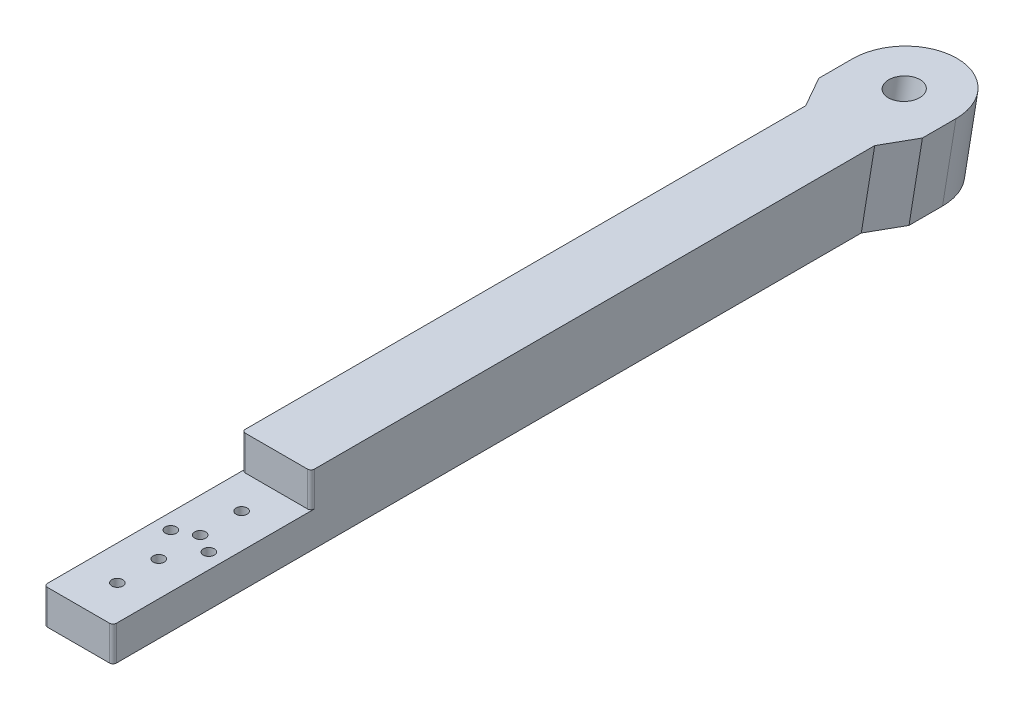
ISO-10303-21;
HEADER;
FILE_DESCRIPTION(('STEP AP214'),'2;1');
FILE_NAME('part.step','',(''),(''),'','','');
FILE_SCHEMA(('AUTOMOTIVE_DESIGN { 1 0 10303 214 1 1 1 1 }'));
ENDSEC;
DATA;
#1=APPLICATION_CONTEXT('core data for automotive mechanical design processes');
#2=APPLICATION_PROTOCOL_DEFINITION('international standard','automotive_design',2000,#1);
#3=PRODUCT_CONTEXT('',#1,'mechanical');
#4=PRODUCT('Part','Part','',(#3));
#5=PRODUCT_RELATED_PRODUCT_CATEGORY('part','',(#4));
#6=PRODUCT_DEFINITION_FORMATION('','',#4);
#7=PRODUCT_DEFINITION_CONTEXT('part definition',#1,'design');
#8=PRODUCT_DEFINITION('design','',#6,#7);
#9=PRODUCT_DEFINITION_SHAPE('','',#8);
#10=(LENGTH_UNIT() NAMED_UNIT(*) SI_UNIT(.MILLI.,.METRE.));
#11=(NAMED_UNIT(*) PLANE_ANGLE_UNIT() SI_UNIT($,.RADIAN.));
#12=(NAMED_UNIT(*) SI_UNIT($,.STERADIAN.) SOLID_ANGLE_UNIT());
#13=UNCERTAINTY_MEASURE_WITH_UNIT(LENGTH_MEASURE(1.E-05),#10,'distance_accuracy_value','');
#14=(GEOMETRIC_REPRESENTATION_CONTEXT(3) GLOBAL_UNCERTAINTY_ASSIGNED_CONTEXT((#13)) GLOBAL_UNIT_ASSIGNED_CONTEXT((#10,
#11,#12)) REPRESENTATION_CONTEXT('',''));
#15=CARTESIAN_POINT('',(0.,0.,0.));
#16=DIRECTION('',(0.,0.,1.));
#17=DIRECTION('',(1.,0.,0.));
#18=AXIS2_PLACEMENT_3D('',#15,#16,#17);
#19=CARTESIAN_POINT('',(-9.,10.,-58.35));
#20=DIRECTION('',(0.,1.,0.));
#21=DIRECTION('',(0.,0.,1.));
#22=AXIS2_PLACEMENT_3D('',#19,#20,#21);
#23=CYLINDRICAL_SURFACE('',#22,1.);
#24=CARTESIAN_POINT('',(-9.,10.,-58.35));
#25=DIRECTION('',(0.,1.,0.));
#26=DIRECTION('',(0.,0.,1.));
#27=AXIS2_PLACEMENT_3D('',#24,#25,#26);
#28=CIRCLE('',#27,1.);
#29=CARTESIAN_POINT('',(-10.,10.,-58.35));
#30=VERTEX_POINT('',#29);
#31=CARTESIAN_POINT('',(-9.,10.,-57.35));
#32=VERTEX_POINT('',#31);
#33=EDGE_CURVE('E310',#30,#32,#28,.T.);
#34=ORIENTED_EDGE('',*,*,#33,.F.);
#35=DIRECTION('',(0.,1.,0.));
#36=VECTOR('',#35,1.);
#37=CARTESIAN_POINT('',(-10.,10.,-58.35));
#38=LINE('',#37,#36);
#39=CARTESIAN_POINT('',(-10.,0.,-58.35));
#40=VERTEX_POINT('',#39);
#41=EDGE_CURVE('E213',#40,#30,#38,.T.);
#42=ORIENTED_EDGE('',*,*,#41,.F.);
#43=CARTESIAN_POINT('',(-9.,0.,-58.35));
#44=DIRECTION('',(0.,-1.,0.));
#45=DIRECTION('',(0.,0.,-1.));
#46=AXIS2_PLACEMENT_3D('',#43,#44,#45);
#47=CIRCLE('',#46,1.);
#48=CARTESIAN_POINT('',(-9.,0.,-57.35));
#49=VERTEX_POINT('',#48);
#50=EDGE_CURVE('E47',#49,#40,#47,.T.);
#51=ORIENTED_EDGE('',*,*,#50,.F.);
#52=DIRECTION('',(0.,-1.,0.));
#53=VECTOR('',#52,1.);
#54=CARTESIAN_POINT('',(-9.,0.,-57.35));
#55=LINE('',#54,#53);
#56=EDGE_CURVE('E349',#32,#49,#55,.T.);
#57=ORIENTED_EDGE('',*,*,#56,.F.);
#58=EDGE_LOOP('',(#34,#42,#51,#57));
#59=FACE_BOUND('',#58,.T.);
#60=ADVANCED_FACE('F17',(#59),#23,.T.);
#61=CARTESIAN_POINT('',(9.,-10.,-1.));
#62=DIRECTION('',(0.,1.,0.));
#63=DIRECTION('',(0.,0.,1.));
#64=AXIS2_PLACEMENT_3D('',#61,#62,#63);
#65=CYLINDRICAL_SURFACE('',#64,1.);
#66=CARTESIAN_POINT('',(9.,-10.,-1.));
#67=DIRECTION('',(0.,-1.,0.));
#68=DIRECTION('',(0.,0.,1.));
#69=AXIS2_PLACEMENT_3D('',#66,#67,#68);
#70=CIRCLE('',#69,1.);
#71=CARTESIAN_POINT('',(10.,-10.,-1.));
#72=VERTEX_POINT('',#71);
#73=CARTESIAN_POINT('',(9.,-10.,0.));
#74=VERTEX_POINT('',#73);
#75=EDGE_CURVE('E165',#72,#74,#70,.T.);
#76=ORIENTED_EDGE('',*,*,#75,.F.);
#77=DIRECTION('',(0.,-1.,0.));
#78=VECTOR('',#77,1.);
#79=CARTESIAN_POINT('',(10.,-10.,-1.));
#80=LINE('',#79,#78);
#81=CARTESIAN_POINT('',(10.,0.,-1.));
#82=VERTEX_POINT('',#81);
#83=EDGE_CURVE('E163',#82,#72,#80,.T.);
#84=ORIENTED_EDGE('',*,*,#83,.F.);
#85=CARTESIAN_POINT('',(9.,0.,-1.));
#86=DIRECTION('',(0.,1.,0.));
#87=DIRECTION('',(0.,0.,-1.));
#88=AXIS2_PLACEMENT_3D('',#85,#86,#87);
#89=CIRCLE('',#88,1.);
#90=CARTESIAN_POINT('',(9.,0.,0.));
#91=VERTEX_POINT('',#90);
#92=EDGE_CURVE('E148',#91,#82,#89,.T.);
#93=ORIENTED_EDGE('',*,*,#92,.F.);
#94=DIRECTION('',(0.,1.,0.));
#95=VECTOR('',#94,1.);
#96=CARTESIAN_POINT('',(9.,-10.,0.));
#97=LINE('',#96,#95);
#98=EDGE_CURVE('E193',#74,#91,#97,.T.);
#99=ORIENTED_EDGE('',*,*,#98,.F.);
#100=EDGE_LOOP('',(#76,#84,#93,#99));
#101=FACE_BOUND('',#100,.T.);
#102=ADVANCED_FACE('F164',(#101),#65,.T.);
#103=CARTESIAN_POINT('',(-9.,-10.,-1.));
#104=DIRECTION('',(0.,1.,0.));
#105=DIRECTION('',(0.,0.,1.));
#106=AXIS2_PLACEMENT_3D('',#103,#104,#105);
#107=CYLINDRICAL_SURFACE('',#106,1.);
#108=CARTESIAN_POINT('',(-9.,-10.,-1.));
#109=DIRECTION('',(0.,-1.,0.));
#110=DIRECTION('',(0.,0.,1.));
#111=AXIS2_PLACEMENT_3D('',#108,#109,#110);
#112=CIRCLE('',#111,1.);
#113=CARTESIAN_POINT('',(-9.,-10.,0.));
#114=VERTEX_POINT('',#113);
#115=CARTESIAN_POINT('',(-10.,-10.,-1.));
#116=VERTEX_POINT('',#115);
#117=EDGE_CURVE('E268',#114,#116,#112,.T.);
#118=ORIENTED_EDGE('',*,*,#117,.F.);
#119=DIRECTION('',(0.,-1.,0.));
#120=VECTOR('',#119,1.);
#121=CARTESIAN_POINT('',(-9.,-10.,0.));
#122=LINE('',#121,#120);
#123=CARTESIAN_POINT('',(-9.,0.,0.));
#124=VERTEX_POINT('',#123);
#125=EDGE_CURVE('E246',#124,#114,#122,.T.);
#126=ORIENTED_EDGE('',*,*,#125,.F.);
#127=CARTESIAN_POINT('',(-9.,0.,-1.));
#128=DIRECTION('',(0.,1.,0.));
#129=DIRECTION('',(0.,0.,-1.));
#130=AXIS2_PLACEMENT_3D('',#127,#128,#129);
#131=CIRCLE('',#130,1.);
#132=CARTESIAN_POINT('',(-10.,0.,-1.));
#133=VERTEX_POINT('',#132);
#134=EDGE_CURVE('E386',#133,#124,#131,.T.);
#135=ORIENTED_EDGE('',*,*,#134,.F.);
#136=DIRECTION('',(0.,1.,0.));
#137=VECTOR('',#136,1.);
#138=CARTESIAN_POINT('',(-10.,-10.,-1.));
#139=LINE('',#138,#137);
#140=EDGE_CURVE('E187',#116,#133,#139,.T.);
#141=ORIENTED_EDGE('',*,*,#140,.F.);
#142=EDGE_LOOP('',(#118,#126,#135,#141));
#143=FACE_BOUND('',#142,.T.);
#144=ADVANCED_FACE('F454',(#143),#107,.T.);
#145=CARTESIAN_POINT('',(9.,10.,-58.35));
#146=DIRECTION('',(0.,-1.,0.));
#147=DIRECTION('',(0.,0.,-1.));
#148=AXIS2_PLACEMENT_3D('',#145,#146,#147);
#149=CYLINDRICAL_SURFACE('',#148,1.);
#150=CARTESIAN_POINT('',(9.,0.,-58.35));
#151=DIRECTION('',(0.,-1.,0.));
#152=DIRECTION('',(0.,0.,-1.));
#153=AXIS2_PLACEMENT_3D('',#150,#151,#152);
#154=CIRCLE('',#153,1.);
#155=CARTESIAN_POINT('',(10.,0.,-58.35));
#156=VERTEX_POINT('',#155);
#157=CARTESIAN_POINT('',(9.,0.,-57.35));
#158=VERTEX_POINT('',#157);
#159=EDGE_CURVE('E37',#156,#158,#154,.T.);
#160=ORIENTED_EDGE('',*,*,#159,.F.);
#161=DIRECTION('',(0.,-1.,0.));
#162=VECTOR('',#161,1.);
#163=CARTESIAN_POINT('',(10.,0.,-58.35));
#164=LINE('',#163,#162);
#165=CARTESIAN_POINT('',(10.,10.,-58.35));
#166=VERTEX_POINT('',#165);
#167=EDGE_CURVE('E176',#166,#156,#164,.T.);
#168=ORIENTED_EDGE('',*,*,#167,.F.);
#169=CARTESIAN_POINT('',(9.,10.,-58.35));
#170=DIRECTION('',(0.,1.,0.));
#171=DIRECTION('',(0.,0.,1.));
#172=AXIS2_PLACEMENT_3D('',#169,#170,#171);
#173=CIRCLE('',#172,1.);
#174=CARTESIAN_POINT('',(9.,10.,-57.35));
#175=VERTEX_POINT('',#174);
#176=EDGE_CURVE('E318',#175,#166,#173,.T.);
#177=ORIENTED_EDGE('',*,*,#176,.F.);
#178=DIRECTION('',(0.,1.,0.));
#179=VECTOR('',#178,1.);
#180=CARTESIAN_POINT('',(9.,10.,-57.35));
#181=LINE('',#180,#179);
#182=EDGE_CURVE('E360',#158,#175,#181,.T.);
#183=ORIENTED_EDGE('',*,*,#182,.F.);
#184=EDGE_LOOP('',(#160,#168,#177,#183));
#185=FACE_BOUND('',#184,.T.);
#186=ADVANCED_FACE('F445',(#185),#149,.T.);
#187=CARTESIAN_POINT('',(0.,-103.34010436122,-217.188165052237));
#188=DIRECTION('',(0.,0.981627183447664,-0.190808995376545));
#189=DIRECTION('',(0.,0.190808995376545,0.981627183447664));
#190=AXIS2_PLACEMENT_3D('',#187,#188,#189);
#191=CYLINDRICAL_SURFACE('',#190,4.5);
#192=CARTESIAN_POINT('',(0.,-10.,-235.331643392917));
#193=DIRECTION('',(0.,1.,0.));
#194=DIRECTION('',(0.,0.,-1.));
#195=AXIS2_PLACEMENT_3D('',#192,#193,#194);
#196=ELLIPSE('',#195,4.58422512729847,4.5);
#197=CARTESIAN_POINT('',(0.,-10.,-239.915868520215));
#198=VERTEX_POINT('',#197);
#199=EDGE_CURVE('E256',#198,#198,#196,.T.);
#200=ORIENTED_EDGE('',*,*,#199,.F.);
#201=EDGE_LOOP('',(#200));
#202=FACE_BOUND('',#201,.T.);
#203=CARTESIAN_POINT('',(0.,10.,-239.219249575672));
#204=DIRECTION('',(0.,1.,0.));
#205=DIRECTION('',(0.,0.,-1.));
#206=AXIS2_PLACEMENT_3D('',#203,#204,#205);
#207=ELLIPSE('',#206,4.58422512729847,4.5);
#208=CARTESIAN_POINT('',(0.,10.,-243.80347470297));
#209=VERTEX_POINT('',#208);
#210=EDGE_CURVE('E306',#209,#209,#207,.T.);
#211=ORIENTED_EDGE('',*,*,#210,.T.);
#212=EDGE_LOOP('',(#211));
#213=FACE_BOUND('',#212,.T.);
#214=ADVANCED_FACE('F481',(#202,#213),#191,.F.);
#215=CARTESIAN_POINT('',(10.,-50.6054907674769,-208.897140598269));
#216=DIRECTION('',(-0.866025403784439,-0.0954044976882719,-0.490813591723831));
#217=DIRECTION('',(-0.493062653792699,0.,0.86999380425087));
#218=AXIS2_PLACEMENT_3D('',#215,#216,#217);
#219=PLANE('',#218);
#220=DIRECTION('',(-0.493062653792699,0.,0.86999380425087));
#221=VECTOR('',#220,1.);
#222=CARTESIAN_POINT('',(-85.4256821797924,-10.,-48.4143833574641));
#223=LINE('',#222,#221);
#224=CARTESIAN_POINT('',(15.,-10.,-225.612393817246));
#225=VERTEX_POINT('',#224);
#226=CARTESIAN_POINT('',(10.,-10.,-216.79004844634));
#227=VERTEX_POINT('',#226);
#228=EDGE_CURVE('E291',#225,#227,#223,.T.);
#229=ORIENTED_EDGE('',*,*,#228,.F.);
#230=DIRECTION('',(0.,-0.981627183447664,0.190808995376544));
#231=VECTOR('',#230,1.);
#232=CARTESIAN_POINT('',(15.,10.,-229.5));
#233=LINE('',#232,#231);
#234=CARTESIAN_POINT('',(15.,10.,-229.5));
#235=VERTEX_POINT('',#234);
#236=EDGE_CURVE('E364',#235,#225,#233,.T.);
#237=ORIENTED_EDGE('',*,*,#236,.F.);
#238=DIRECTION('',(0.493062653792699,0.,-0.86999380425087));
#239=VECTOR('',#238,1.);
#240=CARTESIAN_POINT('',(4.94661357356375,10.,-211.761110559761));
#241=LINE('',#240,#239);
#242=CARTESIAN_POINT('',(10.,10.,-220.677654629095));
#243=VERTEX_POINT('',#242);
#244=EDGE_CURVE('E321',#243,#235,#241,.T.);
#245=ORIENTED_EDGE('',*,*,#244,.F.);
#246=DIRECTION('',(0.,0.981627183447664,-0.190808995376544));
#247=VECTOR('',#246,1.);
#248=CARTESIAN_POINT('',(10.,-50.6054907674769,-208.897140598269));
#249=LINE('',#248,#247);
#250=EDGE_CURVE('E194',#227,#243,#249,.T.);
#251=ORIENTED_EDGE('',*,*,#250,.F.);
#252=EDGE_LOOP('',(#229,#237,#245,#251));
#253=FACE_BOUND('',#252,.T.);
#254=ADVANCED_FACE('F441',(#253),#219,.F.);
#255=CARTESIAN_POINT('',(-10.,-7.61938417300114,-217.25279328673));
#256=DIRECTION('',(0.866025403784438,-0.0954044976882722,-0.490813591723833));
#257=DIRECTION('',(0.,-0.981627183447664,0.190808995376544));
#258=AXIS2_PLACEMENT_3D('',#255,#256,#257);
#259=PLANE('',#258);
#260=DIRECTION('',(0.493062653792701,0.,0.869993804250869));
#261=VECTOR('',#260,1.);
#262=CARTESIAN_POINT('',(-8.53086649914912,10.,-218.085414001));
#263=LINE('',#262,#261);
#264=CARTESIAN_POINT('',(-15.,10.,-229.5));
#265=VERTEX_POINT('',#264);
#266=CARTESIAN_POINT('',(-10.,10.,-220.677654629095));
#267=VERTEX_POINT('',#266);
#268=EDGE_CURVE('E346',#265,#267,#263,.T.);
#269=ORIENTED_EDGE('',*,*,#268,.F.);
#270=DIRECTION('',(0.,-0.981627183447664,0.190808995376544));
#271=VECTOR('',#270,1.);
#272=CARTESIAN_POINT('',(-15.,10.,-229.5));
#273=LINE('',#272,#271);
#274=CARTESIAN_POINT('',(-15.,-10.,-225.612393817246));
#275=VERTEX_POINT('',#274);
#276=EDGE_CURVE('E11',#265,#275,#273,.T.);
#277=ORIENTED_EDGE('',*,*,#276,.T.);
#278=DIRECTION('',(-0.493062653792701,0.,-0.869993804250869));
#279=VECTOR('',#278,1.);
#280=CARTESIAN_POINT('',(85.4256821797926,-10.,-48.4143833574643));
#281=LINE('',#280,#279);
#282=CARTESIAN_POINT('',(-10.,-10.,-216.79004844634));
#283=VERTEX_POINT('',#282);
#284=EDGE_CURVE('E271',#283,#275,#281,.T.);
#285=ORIENTED_EDGE('',*,*,#284,.F.);
#286=DIRECTION('',(0.,-0.981627183447664,0.190808995376544));
#287=VECTOR('',#286,1.);
#288=CARTESIAN_POINT('',(-10.,-7.61938417300114,-217.25279328673));
#289=LINE('',#288,#287);
#290=EDGE_CURVE('E188',#267,#283,#289,.T.);
#291=ORIENTED_EDGE('',*,*,#290,.F.);
#292=EDGE_LOOP('',(#269,#277,#285,#291));
#293=FACE_BOUND('',#292,.T.);
#294=ADVANCED_FACE('F430',(#293),#259,.F.);
#295=CARTESIAN_POINT('',(0.,-44.4424733543604,-228.636704774829));
#296=DIRECTION('',(0.,-0.981627183447664,0.190808995376544));
#297=DIRECTION('',(0.,-0.190808995376544,-0.981627183447664));
#298=AXIS2_PLACEMENT_3D('',#295,#296,#297);
#299=CYLINDRICAL_SURFACE('',#298,15.);
#300=CARTESIAN_POINT('',(0.,-10.,-235.331643392917));
#301=DIRECTION('',(0.,-1.,0.));
#302=DIRECTION('',(0.,0.,1.));
#303=AXIS2_PLACEMENT_3D('',#300,#301,#302);
#304=ELLIPSE('',#303,15.2807504243282,15.);
#305=CARTESIAN_POINT('',(-15.,-10.,-235.331643392917));
#306=VERTEX_POINT('',#305);
#307=CARTESIAN_POINT('',(15.,-10.,-235.331643392917));
#308=VERTEX_POINT('',#307);
#309=EDGE_CURVE('E279',#306,#308,#304,.T.);
#310=ORIENTED_EDGE('',*,*,#309,.F.);
#311=DIRECTION('',(0.,-0.981627183447664,0.190808995376544));
#312=VECTOR('',#311,1.);
#313=CARTESIAN_POINT('',(-15.,-44.4424733543604,-228.636704774829));
#314=LINE('',#313,#312);
#315=CARTESIAN_POINT('',(-15.,10.,-239.219249575672));
#316=VERTEX_POINT('',#315);
#317=EDGE_CURVE('E25',#316,#306,#314,.T.);
#318=ORIENTED_EDGE('',*,*,#317,.F.);
#319=CARTESIAN_POINT('',(0.,10.,-239.219249575672));
#320=DIRECTION('',(0.,1.,0.));
#321=DIRECTION('',(0.,0.,1.));
#322=AXIS2_PLACEMENT_3D('',#319,#320,#321);
#323=ELLIPSE('',#322,15.2807504243282,15.);
#324=CARTESIAN_POINT('',(15.,10.,-239.219249575672));
#325=VERTEX_POINT('',#324);
#326=EDGE_CURVE('E338',#325,#316,#323,.T.);
#327=ORIENTED_EDGE('',*,*,#326,.F.);
#328=DIRECTION('',(0.,0.981627183447664,-0.190808995376544));
#329=VECTOR('',#328,1.);
#330=CARTESIAN_POINT('',(15.,12.8621349306482,-239.775592248285));
#331=LINE('',#330,#329);
#332=EDGE_CURVE('E361',#308,#325,#331,.T.);
#333=ORIENTED_EDGE('',*,*,#332,.F.);
#334=EDGE_LOOP('',(#310,#318,#327,#333));
#335=FACE_BOUND('',#334,.T.);
#336=ADVANCED_FACE('F421',(#335),#299,.T.);
#337=CARTESIAN_POINT('',(-15.,0.,0.));
#338=DIRECTION('',(1.,0.,0.));
#339=DIRECTION('',(0.,-1.,0.));
#340=AXIS2_PLACEMENT_3D('',#337,#338,#339);
#341=PLANE('',#340);
#342=DIRECTION('',(0.,0.,1.));
#343=VECTOR('',#342,1.);
#344=CARTESIAN_POINT('',(-15.,10.,-254.5));
#345=LINE('',#344,#343);
#346=EDGE_CURVE('E342',#316,#265,#345,.T.);
#347=ORIENTED_EDGE('',*,*,#346,.F.);
#348=ORIENTED_EDGE('',*,*,#317,.T.);
#349=DIRECTION('',(0.,0.,-1.));
#350=VECTOR('',#349,1.);
#351=CARTESIAN_POINT('',(-15.,-10.,-225.612393817246));
#352=LINE('',#351,#350);
#353=EDGE_CURVE('E275',#275,#306,#352,.T.);
#354=ORIENTED_EDGE('',*,*,#353,.F.);
#355=ORIENTED_EDGE('',*,*,#276,.F.);
#356=EDGE_LOOP('',(#347,#348,#354,#355));
#357=FACE_BOUND('',#356,.T.);
#358=ADVANCED_FACE('F418',(#357),#341,.F.);
#359=CARTESIAN_POINT('',(15.,0.,0.));
#360=DIRECTION('',(1.,0.,0.));
#361=DIRECTION('',(0.,-1.,0.));
#362=AXIS2_PLACEMENT_3D('',#359,#360,#361);
#363=PLANE('',#362);
#364=DIRECTION('',(0.,0.,-1.));
#365=VECTOR('',#364,1.);
#366=CARTESIAN_POINT('',(15.,-10.,-225.612393817246));
#367=LINE('',#366,#365);
#368=EDGE_CURVE('E287',#225,#308,#367,.T.);
#369=ORIENTED_EDGE('',*,*,#368,.T.);
#370=ORIENTED_EDGE('',*,*,#332,.T.);
#371=DIRECTION('',(0.,0.,1.));
#372=VECTOR('',#371,1.);
#373=CARTESIAN_POINT('',(15.,10.,-254.5));
#374=LINE('',#373,#372);
#375=EDGE_CURVE('E325',#325,#235,#374,.T.);
#376=ORIENTED_EDGE('',*,*,#375,.T.);
#377=ORIENTED_EDGE('',*,*,#236,.T.);
#378=EDGE_LOOP('',(#369,#370,#376,#377));
#379=FACE_BOUND('',#378,.T.);
#380=ADVANCED_FACE('F437',(#379),#363,.T.);
#381=CARTESIAN_POINT('',(5.5,110.,-32.26));
#382=DIRECTION('',(0.,-1.,0.));
#383=DIRECTION('',(0.,0.,-1.));
#384=AXIS2_PLACEMENT_3D('',#381,#382,#383);
#385=CYLINDRICAL_SURFACE('',#384,1.6);
#386=CARTESIAN_POINT('',(5.5,0.,-32.26));
#387=DIRECTION('',(0.,1.,0.));
#388=DIRECTION('',(0.,0.,-1.));
#389=AXIS2_PLACEMENT_3D('',#386,#387,#388);
#390=CIRCLE('',#389,1.6);
#391=CARTESIAN_POINT('',(5.5,0.,-33.86));
#392=VERTEX_POINT('',#391);
#393=EDGE_CURVE('E374',#392,#392,#390,.T.);
#394=ORIENTED_EDGE('',*,*,#393,.T.);
#395=EDGE_LOOP('',(#394));
#396=FACE_BOUND('',#395,.T.);
#397=CARTESIAN_POINT('',(5.5,-4.3,-32.26));
#398=DIRECTION('',(0.,-1.,0.));
#399=DIRECTION('',(0.,0.,1.));
#400=AXIS2_PLACEMENT_3D('',#397,#398,#399);
#401=CIRCLE('',#400,1.6);
#402=CARTESIAN_POINT('',(5.5,-4.3,-30.66));
#403=VERTEX_POINT('',#402);
#404=EDGE_CURVE('E204',#403,#403,#401,.T.);
#405=ORIENTED_EDGE('',*,*,#404,.T.);
#406=EDGE_LOOP('',(#405));
#407=FACE_BOUND('',#406,.T.);
#408=ADVANCED_FACE('F493',(#396,#407),#385,.F.);
#409=CARTESIAN_POINT('',(-5.5,110.,-32.26));
#410=DIRECTION('',(0.,-1.,0.));
#411=DIRECTION('',(0.,0.,-1.));
#412=AXIS2_PLACEMENT_3D('',#409,#410,#411);
#413=CYLINDRICAL_SURFACE('',#412,1.6);
#414=CARTESIAN_POINT('',(-5.5,0.,-32.26));
#415=DIRECTION('',(0.,1.,0.));
#416=DIRECTION('',(0.,0.,-1.));
#417=AXIS2_PLACEMENT_3D('',#414,#415,#416);
#418=CIRCLE('',#417,1.6);
#419=CARTESIAN_POINT('',(-5.5,0.,-33.86));
#420=VERTEX_POINT('',#419);
#421=EDGE_CURVE('E367',#420,#420,#418,.T.);
#422=ORIENTED_EDGE('',*,*,#421,.T.);
#423=EDGE_LOOP('',(#422));
#424=FACE_BOUND('',#423,.T.);
#425=CARTESIAN_POINT('',(-5.5,-4.3,-32.26));
#426=DIRECTION('',(0.,-1.,0.));
#427=DIRECTION('',(0.,0.,1.));
#428=AXIS2_PLACEMENT_3D('',#425,#426,#427);
#429=CIRCLE('',#428,1.6);
#430=CARTESIAN_POINT('',(-5.5,-4.3,-30.66));
#431=VERTEX_POINT('',#430);
#432=EDGE_CURVE('E203',#431,#431,#429,.T.);
#433=ORIENTED_EDGE('',*,*,#432,.T.);
#434=EDGE_LOOP('',(#433));
#435=FACE_BOUND('',#434,.T.);
#436=ADVANCED_FACE('F498',(#424,#435),#413,.F.);
#437=CARTESIAN_POINT('',(-5.5,-4.3,-32.26));
#438=DIRECTION('',(0.,-1.,0.));
#439=DIRECTION('',(0.,0.,-1.));
#440=AXIS2_PLACEMENT_3D('',#437,#438,#439);
#441=CYLINDRICAL_SURFACE('',#440,2.3);
#442=CARTESIAN_POINT('',(-5.5,-10.,-32.26));
#443=DIRECTION('',(0.,1.,0.));
#444=DIRECTION('',(0.,0.,1.));
#445=AXIS2_PLACEMENT_3D('',#442,#443,#444);
#446=CIRCLE('',#445,2.3);
#447=CARTESIAN_POINT('',(-5.5,-10.,-29.96));
#448=VERTEX_POINT('',#447);
#449=EDGE_CURVE('E237',#448,#448,#446,.T.);
#450=ORIENTED_EDGE('',*,*,#449,.F.);
#451=EDGE_LOOP('',(#450));
#452=FACE_BOUND('',#451,.T.);
#453=CARTESIAN_POINT('',(-5.5,-4.3,-32.26));
#454=DIRECTION('',(0.,1.,0.));
#455=DIRECTION('',(0.,0.,1.));
#456=AXIS2_PLACEMENT_3D('',#453,#454,#455);
#457=CIRCLE('',#456,2.3);
#458=CARTESIAN_POINT('',(-5.5,-4.3,-29.96));
#459=VERTEX_POINT('',#458);
#460=EDGE_CURVE('E283',#459,#459,#457,.T.);
#461=ORIENTED_EDGE('',*,*,#460,.T.);
#462=EDGE_LOOP('',(#461));
#463=FACE_BOUND('',#462,.T.);
#464=ADVANCED_FACE('F502',(#452,#463),#441,.F.);
#465=CARTESIAN_POINT('',(-5.5,-4.3,-32.26));
#466=DIRECTION('',(0.,1.,0.));
#467=DIRECTION('',(1.,0.,0.));
#468=AXIS2_PLACEMENT_3D('',#465,#466,#467);
#469=PLANE('',#468);
#470=ORIENTED_EDGE('',*,*,#460,.F.);
#471=EDGE_LOOP('',(#470));
#472=FACE_BOUND('',#471,.T.);
#473=ORIENTED_EDGE('',*,*,#432,.F.);
#474=EDGE_LOOP('',(#473));
#475=FACE_BOUND('',#474,.T.);
#476=ADVANCED_FACE('F506',(#472,#475),#469,.F.);
#477=CARTESIAN_POINT('',(5.5,-4.3,-32.26));
#478=DIRECTION('',(0.,-1.,0.));
#479=DIRECTION('',(0.,0.,-1.));
#480=AXIS2_PLACEMENT_3D('',#477,#478,#479);
#481=CYLINDRICAL_SURFACE('',#480,2.3);
#482=CARTESIAN_POINT('',(5.5,-10.,-32.26));
#483=DIRECTION('',(0.,1.,0.));
#484=DIRECTION('',(0.,0.,1.));
#485=AXIS2_PLACEMENT_3D('',#482,#483,#484);
#486=CIRCLE('',#485,2.3);
#487=CARTESIAN_POINT('',(5.5,-10.,-29.96));
#488=VERTEX_POINT('',#487);
#489=EDGE_CURVE('E233',#488,#488,#486,.T.);
#490=ORIENTED_EDGE('',*,*,#489,.F.);
#491=EDGE_LOOP('',(#490));
#492=FACE_BOUND('',#491,.T.);
#493=CARTESIAN_POINT('',(5.5,-4.3,-32.26));
#494=DIRECTION('',(0.,1.,0.));
#495=DIRECTION('',(0.,0.,1.));
#496=AXIS2_PLACEMENT_3D('',#493,#494,#495);
#497=CIRCLE('',#496,2.3);
#498=CARTESIAN_POINT('',(5.5,-4.3,-29.96));
#499=VERTEX_POINT('',#498);
#500=EDGE_CURVE('E199',#499,#499,#497,.T.);
#501=ORIENTED_EDGE('',*,*,#500,.T.);
#502=EDGE_LOOP('',(#501));
#503=FACE_BOUND('',#502,.T.);
#504=ADVANCED_FACE('F510',(#492,#503),#481,.F.);
#505=CARTESIAN_POINT('',(5.5,-4.3,-32.26));
#506=DIRECTION('',(0.,1.,0.));
#507=DIRECTION('',(1.,0.,0.));
#508=AXIS2_PLACEMENT_3D('',#505,#506,#507);
#509=PLANE('',#508);
#510=ORIENTED_EDGE('',*,*,#500,.F.);
#511=EDGE_LOOP('',(#510));
#512=FACE_BOUND('',#511,.T.);
#513=ORIENTED_EDGE('',*,*,#404,.F.);
#514=EDGE_LOOP('',(#513));
#515=FACE_BOUND('',#514,.T.);
#516=ADVANCED_FACE('F514',(#512,#515),#509,.F.);
#517=CARTESIAN_POINT('',(0.,-6.,-35.26));
#518=DIRECTION('',(0.,-1.,0.));
#519=DIRECTION('',(0.,0.,-1.));
#520=AXIS2_PLACEMENT_3D('',#517,#518,#519);
#521=CYLINDRICAL_SURFACE('',#520,3.);
#522=CARTESIAN_POINT('',(0.,-10.,-35.26));
#523=DIRECTION('',(0.,1.,0.));
#524=DIRECTION('',(0.,0.,1.));
#525=AXIS2_PLACEMENT_3D('',#522,#523,#524);
#526=CIRCLE('',#525,3.);
#527=CARTESIAN_POINT('',(0.,-10.,-32.26));
#528=VERTEX_POINT('',#527);
#529=EDGE_CURVE('E209',#528,#528,#526,.T.);
#530=ORIENTED_EDGE('',*,*,#529,.F.);
#531=EDGE_LOOP('',(#530));
#532=FACE_BOUND('',#531,.T.);
#533=CARTESIAN_POINT('',(0.,-6.,-35.26));
#534=DIRECTION('',(0.,1.,0.));
#535=DIRECTION('',(0.,0.,1.));
#536=AXIS2_PLACEMENT_3D('',#533,#534,#535);
#537=CIRCLE('',#536,3.);
#538=CARTESIAN_POINT('',(0.,-6.,-32.26));
#539=VERTEX_POINT('',#538);
#540=EDGE_CURVE('E329',#539,#539,#537,.T.);
#541=ORIENTED_EDGE('',*,*,#540,.T.);
#542=EDGE_LOOP('',(#541));
#543=FACE_BOUND('',#542,.T.);
#544=ADVANCED_FACE('F518',(#532,#543),#521,.F.);
#545=CARTESIAN_POINT('',(0.,-6.,-35.26));
#546=DIRECTION('',(0.,1.,0.));
#547=DIRECTION('',(1.,0.,0.));
#548=AXIS2_PLACEMENT_3D('',#545,#546,#547);
#549=PLANE('',#548);
#550=CARTESIAN_POINT('',(0.,-6.,-35.26));
#551=DIRECTION('',(0.,-1.,0.));
#552=DIRECTION('',(0.,0.,1.));
#553=AXIS2_PLACEMENT_3D('',#550,#551,#552);
#554=CIRCLE('',#553,1.6);
#555=CARTESIAN_POINT('',(0.,-6.,-33.66));
#556=VERTEX_POINT('',#555);
#557=EDGE_CURVE('E394',#556,#556,#554,.T.);
#558=ORIENTED_EDGE('',*,*,#557,.F.);
#559=EDGE_LOOP('',(#558));
#560=FACE_BOUND('',#559,.T.);
#561=ORIENTED_EDGE('',*,*,#540,.F.);
#562=EDGE_LOOP('',(#561));
#563=FACE_BOUND('',#562,.T.);
#564=ADVANCED_FACE('F522',(#560,#563),#549,.F.);
#565=CARTESIAN_POINT('',(0.,-6.,-47.26));
#566=DIRECTION('',(0.,-1.,0.));
#567=DIRECTION('',(0.,0.,-1.));
#568=AXIS2_PLACEMENT_3D('',#565,#566,#567);
#569=CYLINDRICAL_SURFACE('',#568,3.);
#570=CARTESIAN_POINT('',(0.,-10.,-47.26));
#571=DIRECTION('',(0.,1.,0.));
#572=DIRECTION('',(0.,0.,1.));
#573=AXIS2_PLACEMENT_3D('',#570,#571,#572);
#574=CIRCLE('',#573,3.);
#575=CARTESIAN_POINT('',(0.,-10.,-44.26));
#576=VERTEX_POINT('',#575);
#577=EDGE_CURVE('E238',#576,#576,#574,.T.);
#578=ORIENTED_EDGE('',*,*,#577,.F.);
#579=EDGE_LOOP('',(#578));
#580=FACE_BOUND('',#579,.T.);
#581=CARTESIAN_POINT('',(0.,-6.,-47.26));
#582=DIRECTION('',(0.,1.,0.));
#583=DIRECTION('',(0.,0.,1.));
#584=AXIS2_PLACEMENT_3D('',#581,#582,#583);
#585=CIRCLE('',#584,3.);
#586=CARTESIAN_POINT('',(0.,-6.,-44.26));
#587=VERTEX_POINT('',#586);
#588=EDGE_CURVE('E264',#587,#587,#585,.T.);
#589=ORIENTED_EDGE('',*,*,#588,.T.);
#590=EDGE_LOOP('',(#589));
#591=FACE_BOUND('',#590,.T.);
#592=ADVANCED_FACE('F526',(#580,#591),#569,.F.);
#593=CARTESIAN_POINT('',(0.,-6.,-47.26));
#594=DIRECTION('',(0.,1.,0.));
#595=DIRECTION('',(1.,0.,0.));
#596=AXIS2_PLACEMENT_3D('',#593,#594,#595);
#597=PLANE('',#596);
#598=CARTESIAN_POINT('',(0.,-6.,-47.26));
#599=DIRECTION('',(0.,-1.,0.));
#600=DIRECTION('',(0.,0.,1.));
#601=AXIS2_PLACEMENT_3D('',#598,#599,#600);
#602=CIRCLE('',#601,1.6);
#603=CARTESIAN_POINT('',(0.,-6.,-45.66));
#604=VERTEX_POINT('',#603);
#605=EDGE_CURVE('E357',#604,#604,#602,.T.);
#606=ORIENTED_EDGE('',*,*,#605,.F.);
#607=EDGE_LOOP('',(#606));
#608=FACE_BOUND('',#607,.T.);
#609=ORIENTED_EDGE('',*,*,#588,.F.);
#610=EDGE_LOOP('',(#609));
#611=FACE_BOUND('',#610,.T.);
#612=ADVANCED_FACE('F530',(#608,#611),#597,.F.);
#613=CARTESIAN_POINT('',(0.,-6.,-11.26));
#614=DIRECTION('',(0.,-1.,0.));
#615=DIRECTION('',(0.,0.,-1.));
#616=AXIS2_PLACEMENT_3D('',#613,#614,#615);
#617=CYLINDRICAL_SURFACE('',#616,3.);
#618=CARTESIAN_POINT('',(0.,-10.,-11.26));
#619=DIRECTION('',(0.,1.,0.));
#620=DIRECTION('',(0.,0.,1.));
#621=AXIS2_PLACEMENT_3D('',#618,#619,#620);
#622=CIRCLE('',#621,3.);
#623=CARTESIAN_POINT('',(0.,-10.,-8.26));
#624=VERTEX_POINT('',#623);
#625=EDGE_CURVE('E210',#624,#624,#622,.T.);
#626=ORIENTED_EDGE('',*,*,#625,.F.);
#627=EDGE_LOOP('',(#626));
#628=FACE_BOUND('',#627,.T.);
#629=CARTESIAN_POINT('',(0.,-6.,-11.26));
#630=DIRECTION('',(0.,1.,0.));
#631=DIRECTION('',(0.,0.,1.));
#632=AXIS2_PLACEMENT_3D('',#629,#630,#631);
#633=CIRCLE('',#632,3.);
#634=CARTESIAN_POINT('',(0.,-6.,-8.26));
#635=VERTEX_POINT('',#634);
#636=EDGE_CURVE('E260',#635,#635,#633,.T.);
#637=ORIENTED_EDGE('',*,*,#636,.T.);
#638=EDGE_LOOP('',(#637));
#639=FACE_BOUND('',#638,.T.);
#640=ADVANCED_FACE('F532',(#628,#639),#617,.F.);
#641=CARTESIAN_POINT('',(0.,-6.,-11.26));
#642=DIRECTION('',(0.,1.,0.));
#643=DIRECTION('',(1.,0.,0.));
#644=AXIS2_PLACEMENT_3D('',#641,#642,#643);
#645=PLANE('',#644);
#646=CARTESIAN_POINT('',(0.,-6.,-11.26));
#647=DIRECTION('',(0.,-1.,0.));
#648=DIRECTION('',(0.,0.,1.));
#649=AXIS2_PLACEMENT_3D('',#646,#647,#648);
#650=CIRCLE('',#649,1.6);
#651=CARTESIAN_POINT('',(0.,-6.,-9.66));
#652=VERTEX_POINT('',#651);
#653=EDGE_CURVE('E334',#652,#652,#650,.T.);
#654=ORIENTED_EDGE('',*,*,#653,.F.);
#655=EDGE_LOOP('',(#654));
#656=FACE_BOUND('',#655,.T.);
#657=ORIENTED_EDGE('',*,*,#636,.F.);
#658=EDGE_LOOP('',(#657));
#659=FACE_BOUND('',#658,.T.);
#660=ADVANCED_FACE('F535',(#656,#659),#645,.F.);
#661=CARTESIAN_POINT('',(0.,-6.,-23.26));
#662=DIRECTION('',(0.,-1.,0.));
#663=DIRECTION('',(0.,0.,-1.));
#664=AXIS2_PLACEMENT_3D('',#661,#662,#663);
#665=CYLINDRICAL_SURFACE('',#664,3.);
#666=CARTESIAN_POINT('',(0.,-10.,-23.26));
#667=DIRECTION('',(0.,1.,0.));
#668=DIRECTION('',(0.,0.,1.));
#669=AXIS2_PLACEMENT_3D('',#666,#667,#668);
#670=CIRCLE('',#669,3.);
#671=CARTESIAN_POINT('',(0.,-10.,-20.26));
#672=VERTEX_POINT('',#671);
#673=EDGE_CURVE('E205',#672,#672,#670,.T.);
#674=ORIENTED_EDGE('',*,*,#673,.F.);
#675=EDGE_LOOP('',(#674));
#676=FACE_BOUND('',#675,.T.);
#677=CARTESIAN_POINT('',(0.,-6.,-23.26));
#678=DIRECTION('',(0.,1.,0.));
#679=DIRECTION('',(0.,0.,1.));
#680=AXIS2_PLACEMENT_3D('',#677,#678,#679);
#681=CIRCLE('',#680,3.);
#682=CARTESIAN_POINT('',(0.,-6.,-20.26));
#683=VERTEX_POINT('',#682);
#684=EDGE_CURVE('E265',#683,#683,#681,.T.);
#685=ORIENTED_EDGE('',*,*,#684,.T.);
#686=EDGE_LOOP('',(#685));
#687=FACE_BOUND('',#686,.T.);
#688=ADVANCED_FACE('F545',(#676,#687),#665,.F.);
#689=CARTESIAN_POINT('',(0.,-6.,-23.26));
#690=DIRECTION('',(0.,1.,0.));
#691=DIRECTION('',(1.,0.,0.));
#692=AXIS2_PLACEMENT_3D('',#689,#690,#691);
#693=PLANE('',#692);
#694=CARTESIAN_POINT('',(0.,-6.,-23.26));
#695=DIRECTION('',(0.,-1.,0.));
#696=DIRECTION('',(0.,0.,1.));
#697=AXIS2_PLACEMENT_3D('',#694,#695,#696);
#698=CIRCLE('',#697,1.6);
#699=CARTESIAN_POINT('',(0.,-6.,-21.66));
#700=VERTEX_POINT('',#699);
#701=EDGE_CURVE('E330',#700,#700,#698,.T.);
#702=ORIENTED_EDGE('',*,*,#701,.F.);
#703=EDGE_LOOP('',(#702));
#704=FACE_BOUND('',#703,.T.);
#705=ORIENTED_EDGE('',*,*,#684,.F.);
#706=EDGE_LOOP('',(#705));
#707=FACE_BOUND('',#706,.T.);
#708=ADVANCED_FACE('F557',(#704,#707),#693,.F.);
#709=CARTESIAN_POINT('',(0.,165.,-23.26));
#710=DIRECTION('',(0.,-1.,0.));
#711=DIRECTION('',(0.,0.,-1.));
#712=AXIS2_PLACEMENT_3D('',#709,#710,#711);
#713=CYLINDRICAL_SURFACE('',#712,1.6);
#714=CARTESIAN_POINT('',(0.,0.,-23.26));
#715=DIRECTION('',(0.,-1.,0.));
#716=DIRECTION('',(0.,0.,-1.));
#717=AXIS2_PLACEMENT_3D('',#714,#715,#716);
#718=CIRCLE('',#717,1.6);
#719=CARTESIAN_POINT('',(0.,0.,-24.86));
#720=VERTEX_POINT('',#719);
#721=EDGE_CURVE('E252',#720,#720,#718,.T.);
#722=ORIENTED_EDGE('',*,*,#721,.F.);
#723=EDGE_LOOP('',(#722));
#724=FACE_BOUND('',#723,.T.);
#725=ORIENTED_EDGE('',*,*,#701,.T.);
#726=EDGE_LOOP('',(#725));
#727=FACE_BOUND('',#726,.T.);
#728=ADVANCED_FACE('F541',(#724,#727),#713,.F.);
#729=CARTESIAN_POINT('',(0.,165.,-11.26));
#730=DIRECTION('',(0.,-1.,0.));
#731=DIRECTION('',(0.,0.,-1.));
#732=AXIS2_PLACEMENT_3D('',#729,#730,#731);
#733=CYLINDRICAL_SURFACE('',#732,1.6);
#734=CARTESIAN_POINT('',(0.,0.,-11.26));
#735=DIRECTION('',(0.,-1.,0.));
#736=DIRECTION('',(0.,0.,-1.));
#737=AXIS2_PLACEMENT_3D('',#734,#735,#736);
#738=CIRCLE('',#737,1.6);
#739=CARTESIAN_POINT('',(0.,0.,-12.86));
#740=VERTEX_POINT('',#739);
#741=EDGE_CURVE('E247',#740,#740,#738,.T.);
#742=ORIENTED_EDGE('',*,*,#741,.F.);
#743=EDGE_LOOP('',(#742));
#744=FACE_BOUND('',#743,.T.);
#745=ORIENTED_EDGE('',*,*,#653,.T.);
#746=EDGE_LOOP('',(#745));
#747=FACE_BOUND('',#746,.T.);
#748=ADVANCED_FACE('F537',(#744,#747),#733,.F.);
#749=CARTESIAN_POINT('',(0.,165.,-47.26));
#750=DIRECTION('',(0.,-1.,0.));
#751=DIRECTION('',(0.,0.,-1.));
#752=AXIS2_PLACEMENT_3D('',#749,#750,#751);
#753=CYLINDRICAL_SURFACE('',#752,1.6);
#754=CARTESIAN_POINT('',(0.,0.,-47.26));
#755=DIRECTION('',(0.,-1.,0.));
#756=DIRECTION('',(0.,0.,-1.));
#757=AXIS2_PLACEMENT_3D('',#754,#755,#756);
#758=CIRCLE('',#757,1.6);
#759=CARTESIAN_POINT('',(0.,0.,-48.86));
#760=VERTEX_POINT('',#759);
#761=EDGE_CURVE('E251',#760,#760,#758,.T.);
#762=ORIENTED_EDGE('',*,*,#761,.F.);
#763=EDGE_LOOP('',(#762));
#764=FACE_BOUND('',#763,.T.);
#765=ORIENTED_EDGE('',*,*,#605,.T.);
#766=EDGE_LOOP('',(#765));
#767=FACE_BOUND('',#766,.T.);
#768=ADVANCED_FACE('F540',(#764,#767),#753,.F.);
#769=CARTESIAN_POINT('',(0.,165.,-35.26));
#770=DIRECTION('',(0.,-1.,0.));
#771=DIRECTION('',(0.,0.,-1.));
#772=AXIS2_PLACEMENT_3D('',#769,#770,#771);
#773=CYLINDRICAL_SURFACE('',#772,1.6);
#774=CARTESIAN_POINT('',(0.,0.,-35.26));
#775=DIRECTION('',(0.,-1.,0.));
#776=DIRECTION('',(0.,0.,-1.));
#777=AXIS2_PLACEMENT_3D('',#774,#775,#776);
#778=CIRCLE('',#777,1.6);
#779=CARTESIAN_POINT('',(0.,0.,-36.86));
#780=VERTEX_POINT('',#779);
#781=EDGE_CURVE('E160',#780,#780,#778,.T.);
#782=ORIENTED_EDGE('',*,*,#781,.F.);
#783=EDGE_LOOP('',(#782));
#784=FACE_BOUND('',#783,.T.);
#785=ORIENTED_EDGE('',*,*,#557,.T.);
#786=EDGE_LOOP('',(#785));
#787=FACE_BOUND('',#786,.T.);
#788=ADVANCED_FACE('F549',(#784,#787),#773,.F.);
#789=CARTESIAN_POINT('',(305.,0.,-57.35));
#790=DIRECTION('',(0.,-1.,0.));
#791=DIRECTION('',(0.,0.,-1.));
#792=AXIS2_PLACEMENT_3D('',#789,#790,#791);
#793=PLANE('',#792);
#794=DIRECTION('',(-1.,0.,0.));
#795=VECTOR('',#794,1.);
#796=CARTESIAN_POINT('',(305.,0.,0.));
#797=LINE('',#796,#795);
#798=EDGE_CURVE('E155',#91,#124,#797,.T.);
#799=ORIENTED_EDGE('',*,*,#798,.F.);
#800=ORIENTED_EDGE('',*,*,#92,.T.);
#801=DIRECTION('',(0.,0.,-1.));
#802=VECTOR('',#801,1.);
#803=CARTESIAN_POINT('',(10.,0.,0.));
#804=LINE('',#803,#802);
#805=EDGE_CURVE('E153',#82,#156,#804,.T.);
#806=ORIENTED_EDGE('',*,*,#805,.T.);
#807=ORIENTED_EDGE('',*,*,#159,.T.);
#808=DIRECTION('',(-1.,0.,0.));
#809=VECTOR('',#808,1.);
#810=CARTESIAN_POINT('',(305.,0.,-57.35));
#811=LINE('',#810,#809);
#812=EDGE_CURVE('E353',#158,#49,#811,.T.);
#813=ORIENTED_EDGE('',*,*,#812,.T.);
#814=ORIENTED_EDGE('',*,*,#50,.T.);
#815=DIRECTION('',(0.,0.,1.));
#816=VECTOR('',#815,1.);
#817=CARTESIAN_POINT('',(-10.,0.,-229.5));
#818=LINE('',#817,#816);
#819=EDGE_CURVE('E218',#40,#133,#818,.T.);
#820=ORIENTED_EDGE('',*,*,#819,.T.);
#821=ORIENTED_EDGE('',*,*,#134,.T.);
#822=EDGE_LOOP('',(#799,#800,#806,#807,#813,#814,#820,#821));
#823=FACE_BOUND('',#822,.T.);
#824=ORIENTED_EDGE('',*,*,#781,.T.);
#825=EDGE_LOOP('',(#824));
#826=FACE_BOUND('',#825,.T.);
#827=ORIENTED_EDGE('',*,*,#761,.T.);
#828=EDGE_LOOP('',(#827));
#829=FACE_BOUND('',#828,.T.);
#830=ORIENTED_EDGE('',*,*,#741,.T.);
#831=EDGE_LOOP('',(#830));
#832=FACE_BOUND('',#831,.T.);
#833=ORIENTED_EDGE('',*,*,#721,.T.);
#834=EDGE_LOOP('',(#833));
#835=FACE_BOUND('',#834,.T.);
#836=ORIENTED_EDGE('',*,*,#393,.F.);
#837=EDGE_LOOP('',(#836));
#838=FACE_BOUND('',#837,.T.);
#839=ORIENTED_EDGE('',*,*,#421,.F.);
#840=EDGE_LOOP('',(#839));
#841=FACE_BOUND('',#840,.T.);
#842=ADVANCED_FACE('F150',(#823,#826,#829,#832,#835,#838,#841),#793,.F.);
#843=CARTESIAN_POINT('',(305.,10.,-57.35));
#844=DIRECTION('',(0.,0.,-1.));
#845=DIRECTION('',(0.,-1.,0.));
#846=AXIS2_PLACEMENT_3D('',#843,#844,#845);
#847=PLANE('',#846);
#848=DIRECTION('',(-1.,0.,0.));
#849=VECTOR('',#848,1.);
#850=CARTESIAN_POINT('',(305.,10.,-57.35));
#851=LINE('',#850,#849);
#852=EDGE_CURVE('E314',#175,#32,#851,.T.);
#853=ORIENTED_EDGE('',*,*,#852,.T.);
#854=ORIENTED_EDGE('',*,*,#56,.T.);
#855=ORIENTED_EDGE('',*,*,#812,.F.);
#856=ORIENTED_EDGE('',*,*,#182,.T.);
#857=EDGE_LOOP('',(#853,#854,#855,#856));
#858=FACE_BOUND('',#857,.T.);
#859=ADVANCED_FACE('F448',(#858),#847,.F.);
#860=CARTESIAN_POINT('',(0.,10.,0.));
#861=DIRECTION('',(0.,1.,0.));
#862=DIRECTION('',(1.,0.,0.));
#863=AXIS2_PLACEMENT_3D('',#860,#861,#862);
#864=PLANE('',#863);
#865=DIRECTION('',(0.,0.,1.));
#866=VECTOR('',#865,1.);
#867=CARTESIAN_POINT('',(-10.,10.,-229.5));
#868=LINE('',#867,#866);
#869=EDGE_CURVE('E217',#267,#30,#868,.T.);
#870=ORIENTED_EDGE('',*,*,#869,.T.);
#871=ORIENTED_EDGE('',*,*,#33,.T.);
#872=ORIENTED_EDGE('',*,*,#852,.F.);
#873=ORIENTED_EDGE('',*,*,#176,.T.);
#874=DIRECTION('',(0.,0.,-1.));
#875=VECTOR('',#874,1.);
#876=CARTESIAN_POINT('',(10.,10.,0.));
#877=LINE('',#876,#875);
#878=EDGE_CURVE('E197',#166,#243,#877,.T.);
#879=ORIENTED_EDGE('',*,*,#878,.T.);
#880=ORIENTED_EDGE('',*,*,#244,.T.);
#881=ORIENTED_EDGE('',*,*,#375,.F.);
#882=ORIENTED_EDGE('',*,*,#326,.T.);
#883=ORIENTED_EDGE('',*,*,#346,.T.);
#884=ORIENTED_EDGE('',*,*,#268,.T.);
#885=EDGE_LOOP('',(#870,#871,#872,#873,#879,#880,#881,#882,#883,#884));
#886=FACE_BOUND('',#885,.T.);
#887=ORIENTED_EDGE('',*,*,#210,.F.);
#888=EDGE_LOOP('',(#887));
#889=FACE_BOUND('',#888,.T.);
#890=ADVANCED_FACE('F433',(#886,#889),#864,.T.);
#891=CARTESIAN_POINT('',(0.,-10.,0.));
#892=DIRECTION('',(0.,1.,0.));
#893=DIRECTION('',(1.,0.,0.));
#894=AXIS2_PLACEMENT_3D('',#891,#892,#893);
#895=PLANE('',#894);
#896=ORIENTED_EDGE('',*,*,#449,.T.);
#897=EDGE_LOOP('',(#896));
#898=FACE_BOUND('',#897,.T.);
#899=ORIENTED_EDGE('',*,*,#489,.T.);
#900=EDGE_LOOP('',(#899));
#901=FACE_BOUND('',#900,.T.);
#902=ORIENTED_EDGE('',*,*,#577,.T.);
#903=EDGE_LOOP('',(#902));
#904=FACE_BOUND('',#903,.T.);
#905=ORIENTED_EDGE('',*,*,#529,.T.);
#906=EDGE_LOOP('',(#905));
#907=FACE_BOUND('',#906,.T.);
#908=ORIENTED_EDGE('',*,*,#673,.T.);
#909=EDGE_LOOP('',(#908));
#910=FACE_BOUND('',#909,.T.);
#911=ORIENTED_EDGE('',*,*,#625,.T.);
#912=EDGE_LOOP('',(#911));
#913=FACE_BOUND('',#912,.T.);
#914=DIRECTION('',(0.,0.,-1.));
#915=VECTOR('',#914,1.);
#916=CARTESIAN_POINT('',(10.,-10.,0.));
#917=LINE('',#916,#915);
#918=EDGE_CURVE('E170',#72,#227,#917,.T.);
#919=ORIENTED_EDGE('',*,*,#918,.F.);
#920=ORIENTED_EDGE('',*,*,#75,.T.);
#921=DIRECTION('',(1.,0.,0.));
#922=VECTOR('',#921,1.);
#923=CARTESIAN_POINT('',(-10.,-10.,0.));
#924=LINE('',#923,#922);
#925=EDGE_CURVE('E189',#114,#74,#924,.T.);
#926=ORIENTED_EDGE('',*,*,#925,.F.);
#927=ORIENTED_EDGE('',*,*,#117,.T.);
#928=DIRECTION('',(0.,0.,1.));
#929=VECTOR('',#928,1.);
#930=CARTESIAN_POINT('',(-10.,-10.,-229.5));
#931=LINE('',#930,#929);
#932=EDGE_CURVE('E183',#283,#116,#931,.T.);
#933=ORIENTED_EDGE('',*,*,#932,.F.);
#934=ORIENTED_EDGE('',*,*,#284,.T.);
#935=ORIENTED_EDGE('',*,*,#353,.T.);
#936=ORIENTED_EDGE('',*,*,#309,.T.);
#937=ORIENTED_EDGE('',*,*,#368,.F.);
#938=ORIENTED_EDGE('',*,*,#228,.T.);
#939=EDGE_LOOP('',(#919,#920,#926,#927,#933,#934,#935,#936,#937,#938));
#940=FACE_BOUND('',#939,.T.);
#941=ORIENTED_EDGE('',*,*,#199,.T.);
#942=EDGE_LOOP('',(#941));
#943=FACE_BOUND('',#942,.T.);
#944=ADVANCED_FACE('F424',(#898,#901,#904,#907,#910,#913,#940,#943),#895,.F.);
#945=CARTESIAN_POINT('',(-10.,-10.,0.));
#946=DIRECTION('',(0.,0.,1.));
#947=DIRECTION('',(1.,0.,0.));
#948=AXIS2_PLACEMENT_3D('',#945,#946,#947);
#949=PLANE('',#948);
#950=ORIENTED_EDGE('',*,*,#925,.T.);
#951=ORIENTED_EDGE('',*,*,#98,.T.);
#952=ORIENTED_EDGE('',*,*,#798,.T.);
#953=ORIENTED_EDGE('',*,*,#125,.T.);
#954=EDGE_LOOP('',(#950,#951,#952,#953));
#955=FACE_BOUND('',#954,.T.);
#956=ADVANCED_FACE('F458',(#955),#949,.T.);
#957=CARTESIAN_POINT('',(-10.,-10.,-229.5));
#958=DIRECTION('',(-1.,0.,0.));
#959=DIRECTION('',(0.,1.,0.));
#960=AXIS2_PLACEMENT_3D('',#957,#958,#959);
#961=PLANE('',#960);
#962=ORIENTED_EDGE('',*,*,#819,.F.);
#963=ORIENTED_EDGE('',*,*,#41,.T.);
#964=ORIENTED_EDGE('',*,*,#869,.F.);
#965=ORIENTED_EDGE('',*,*,#290,.T.);
#966=ORIENTED_EDGE('',*,*,#932,.T.);
#967=ORIENTED_EDGE('',*,*,#140,.T.);
#968=EDGE_LOOP('',(#962,#963,#964,#965,#966,#967));
#969=FACE_BOUND('',#968,.T.);
#970=ADVANCED_FACE('F451',(#969),#961,.T.);
#971=CARTESIAN_POINT('',(10.,-10.,0.));
#972=DIRECTION('',(1.,0.,0.));
#973=DIRECTION('',(0.,0.,1.));
#974=AXIS2_PLACEMENT_3D('',#971,#972,#973);
#975=PLANE('',#974);
#976=ORIENTED_EDGE('',*,*,#805,.F.);
#977=ORIENTED_EDGE('',*,*,#83,.T.);
#978=ORIENTED_EDGE('',*,*,#918,.T.);
#979=ORIENTED_EDGE('',*,*,#250,.T.);
#980=ORIENTED_EDGE('',*,*,#878,.F.);
#981=ORIENTED_EDGE('',*,*,#167,.T.);
#982=EDGE_LOOP('',(#976,#977,#978,#979,#980,#981));
#983=FACE_BOUND('',#982,.T.);
#984=ADVANCED_FACE('F173',(#983),#975,.T.);
#985=CLOSED_SHELL('',(#60,#102,#144,#186,#214,#254,#294,#336,#358,#380,#408,#436,#464,#476,#504,
#516,#544,#564,#592,#612,#640,#660,#688,#708,#728,#748,#768,#788,#842,#859,#890,#944,#956,#970,#984));
#986=MANIFOLD_SOLID_BREP('B1',#985);
#987=ADVANCED_BREP_SHAPE_REPRESENTATION('',(#18,#986),#14);
#988=SHAPE_DEFINITION_REPRESENTATION(#9,#987);
ENDSEC;
END-ISO-10303-21;
